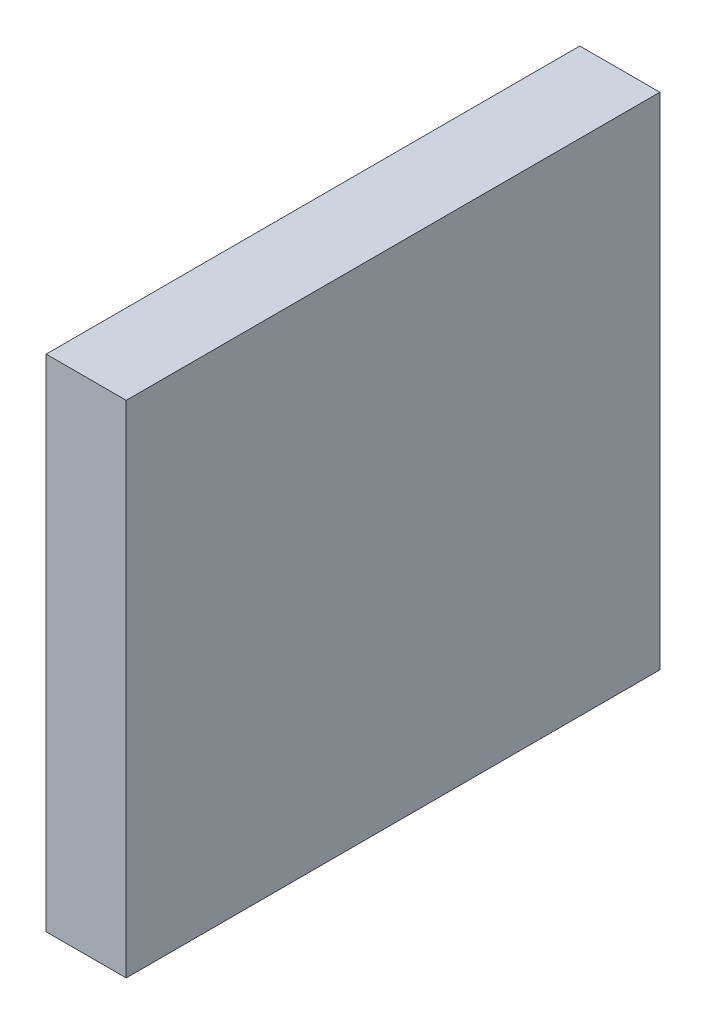
ISO-10303-21;
HEADER;
FILE_DESCRIPTION(('STEP AP214'),'2;1');
FILE_NAME('part.step','',(''),(''),'','','');
FILE_SCHEMA(('AUTOMOTIVE_DESIGN { 1 0 10303 214 1 1 1 1 }'));
ENDSEC;
DATA;
#1=APPLICATION_CONTEXT('core data for automotive mechanical design processes');
#2=APPLICATION_PROTOCOL_DEFINITION('international standard','automotive_design',2000,#1);
#3=PRODUCT_CONTEXT('',#1,'mechanical');
#4=PRODUCT('Part','Part','',(#3));
#5=PRODUCT_RELATED_PRODUCT_CATEGORY('part','',(#4));
#6=PRODUCT_DEFINITION_FORMATION('','',#4);
#7=PRODUCT_DEFINITION_CONTEXT('part definition',#1,'design');
#8=PRODUCT_DEFINITION('design','',#6,#7);
#9=PRODUCT_DEFINITION_SHAPE('','',#8);
#10=(LENGTH_UNIT() NAMED_UNIT(*) SI_UNIT(.MILLI.,.METRE.));
#11=(NAMED_UNIT(*) PLANE_ANGLE_UNIT() SI_UNIT($,.RADIAN.));
#12=(NAMED_UNIT(*) SI_UNIT($,.STERADIAN.) SOLID_ANGLE_UNIT());
#13=UNCERTAINTY_MEASURE_WITH_UNIT(LENGTH_MEASURE(1.E-05),#10,'distance_accuracy_value','');
#14=(GEOMETRIC_REPRESENTATION_CONTEXT(3) GLOBAL_UNCERTAINTY_ASSIGNED_CONTEXT((#13)) GLOBAL_UNIT_ASSIGNED_CONTEXT((#10,
#11,#12)) REPRESENTATION_CONTEXT('',''));
#15=CARTESIAN_POINT('',(0.,0.,0.));
#16=DIRECTION('',(0.,0.,1.));
#17=DIRECTION('',(1.,0.,0.));
#18=AXIS2_PLACEMENT_3D('',#15,#16,#17);
#19=CARTESIAN_POINT('',(0.,0.,96.));
#20=DIRECTION('',(1.,0.,0.));
#21=DIRECTION('',(0.,0.,-1.));
#22=AXIS2_PLACEMENT_3D('',#19,#20,#21);
#23=PLANE('',#22);
#24=DIRECTION('',(0.,-1.,0.));
#25=VECTOR('',#24,1.);
#26=CARTESIAN_POINT('',(0.,0.,0.));
#27=LINE('',#26,#25);
#28=CARTESIAN_POINT('',(0.,90.,0.));
#29=VERTEX_POINT('',#28);
#30=CARTESIAN_POINT('',(0.,0.,0.));
#31=VERTEX_POINT('',#30);
#32=EDGE_CURVE('E107',#29,#31,#27,.T.);
#33=ORIENTED_EDGE('',*,*,#32,.T.);
#34=DIRECTION('',(0.,0.,-1.));
#35=VECTOR('',#34,1.);
#36=CARTESIAN_POINT('',(0.,0.,96.));
#37=LINE('',#36,#35);
#38=CARTESIAN_POINT('',(0.,0.,96.));
#39=VERTEX_POINT('',#38);
#40=EDGE_CURVE('E11',#39,#31,#37,.T.);
#41=ORIENTED_EDGE('',*,*,#40,.F.);
#42=DIRECTION('',(0.,-1.,0.));
#43=VECTOR('',#42,1.);
#44=CARTESIAN_POINT('',(0.,0.,96.));
#45=LINE('',#44,#43);
#46=CARTESIAN_POINT('',(0.,90.,96.));
#47=VERTEX_POINT('',#46);
#48=EDGE_CURVE('E91',#47,#39,#45,.T.);
#49=ORIENTED_EDGE('',*,*,#48,.F.);
#50=DIRECTION('',(0.,0.,-1.));
#51=VECTOR('',#50,1.);
#52=CARTESIAN_POINT('',(0.,90.,96.));
#53=LINE('',#52,#51);
#54=EDGE_CURVE('E103',#47,#29,#53,.T.);
#55=ORIENTED_EDGE('',*,*,#54,.T.);
#56=EDGE_LOOP('',(#33,#41,#49,#55));
#57=FACE_BOUND('',#56,.T.);
#58=ADVANCED_FACE('F39',(#57),#23,.F.);
#59=CARTESIAN_POINT('',(0.,0.,96.));
#60=DIRECTION('',(0.,1.,0.));
#61=DIRECTION('',(0.,0.,1.));
#62=AXIS2_PLACEMENT_3D('',#59,#60,#61);
#63=PLANE('',#62);
#64=DIRECTION('',(1.,0.,0.));
#65=VECTOR('',#64,1.);
#66=CARTESIAN_POINT('',(0.,0.,0.));
#67=LINE('',#66,#65);
#68=CARTESIAN_POINT('',(14.4,0.,0.));
#69=VERTEX_POINT('',#68);
#70=EDGE_CURVE('E96',#31,#69,#67,.T.);
#71=ORIENTED_EDGE('',*,*,#70,.T.);
#72=DIRECTION('',(0.,0.,-1.));
#73=VECTOR('',#72,1.);
#74=CARTESIAN_POINT('',(14.4,0.,96.));
#75=LINE('',#74,#73);
#76=CARTESIAN_POINT('',(14.4,0.,96.));
#77=VERTEX_POINT('',#76);
#78=EDGE_CURVE('E48',#77,#69,#75,.T.);
#79=ORIENTED_EDGE('',*,*,#78,.F.);
#80=DIRECTION('',(1.,0.,0.));
#81=VECTOR('',#80,1.);
#82=CARTESIAN_POINT('',(0.,0.,96.));
#83=LINE('',#82,#81);
#84=EDGE_CURVE('E86',#39,#77,#83,.T.);
#85=ORIENTED_EDGE('',*,*,#84,.F.);
#86=ORIENTED_EDGE('',*,*,#40,.T.);
#87=EDGE_LOOP('',(#71,#79,#85,#86));
#88=FACE_BOUND('',#87,.T.);
#89=ADVANCED_FACE('F95',(#88),#63,.F.);
#90=CARTESIAN_POINT('',(14.4,0.,96.));
#91=DIRECTION('',(-1.,0.,0.));
#92=DIRECTION('',(0.,0.,1.));
#93=AXIS2_PLACEMENT_3D('',#90,#91,#92);
#94=PLANE('',#93);
#95=DIRECTION('',(0.,1.,0.));
#96=VECTOR('',#95,1.);
#97=CARTESIAN_POINT('',(14.4,0.,0.));
#98=LINE('',#97,#96);
#99=CARTESIAN_POINT('',(14.4,90.,0.));
#100=VERTEX_POINT('',#99);
#101=EDGE_CURVE('E73',#69,#100,#98,.T.);
#102=ORIENTED_EDGE('',*,*,#101,.T.);
#103=DIRECTION('',(0.,0.,-1.));
#104=VECTOR('',#103,1.);
#105=CARTESIAN_POINT('',(14.4,90.,96.));
#106=LINE('',#105,#104);
#107=CARTESIAN_POINT('',(14.4,90.,96.));
#108=VERTEX_POINT('',#107);
#109=EDGE_CURVE('E98',#108,#100,#106,.T.);
#110=ORIENTED_EDGE('',*,*,#109,.F.);
#111=DIRECTION('',(0.,1.,0.));
#112=VECTOR('',#111,1.);
#113=CARTESIAN_POINT('',(14.4,0.,96.));
#114=LINE('',#113,#112);
#115=EDGE_CURVE('E89',#77,#108,#114,.T.);
#116=ORIENTED_EDGE('',*,*,#115,.F.);
#117=ORIENTED_EDGE('',*,*,#78,.T.);
#118=EDGE_LOOP('',(#102,#110,#116,#117));
#119=FACE_BOUND('',#118,.T.);
#120=ADVANCED_FACE('F99',(#119),#94,.F.);
#121=CARTESIAN_POINT('',(0.,90.,96.));
#122=DIRECTION('',(0.,-1.,0.));
#123=DIRECTION('',(0.,0.,-1.));
#124=AXIS2_PLACEMENT_3D('',#121,#122,#123);
#125=PLANE('',#124);
#126=DIRECTION('',(-1.,0.,0.));
#127=VECTOR('',#126,1.);
#128=CARTESIAN_POINT('',(0.,90.,0.));
#129=LINE('',#128,#127);
#130=EDGE_CURVE('E79',#100,#29,#129,.T.);
#131=ORIENTED_EDGE('',*,*,#130,.T.);
#132=ORIENTED_EDGE('',*,*,#54,.F.);
#133=DIRECTION('',(-1.,0.,0.));
#134=VECTOR('',#133,1.);
#135=CARTESIAN_POINT('',(0.,90.,96.));
#136=LINE('',#135,#134);
#137=EDGE_CURVE('E56',#108,#47,#136,.T.);
#138=ORIENTED_EDGE('',*,*,#137,.F.);
#139=ORIENTED_EDGE('',*,*,#109,.T.);
#140=EDGE_LOOP('',(#131,#132,#138,#139));
#141=FACE_BOUND('',#140,.T.);
#142=ADVANCED_FACE('F120',(#141),#125,.F.);
#143=CARTESIAN_POINT('',(0.,0.,96.));
#144=DIRECTION('',(0.,0.,-1.));
#145=DIRECTION('',(-1.,0.,0.));
#146=AXIS2_PLACEMENT_3D('',#143,#144,#145);
#147=PLANE('',#146);
#148=ORIENTED_EDGE('',*,*,#48,.T.);
#149=ORIENTED_EDGE('',*,*,#84,.T.);
#150=ORIENTED_EDGE('',*,*,#115,.T.);
#151=ORIENTED_EDGE('',*,*,#137,.T.);
#152=EDGE_LOOP('',(#148,#149,#150,#151));
#153=FACE_BOUND('',#152,.T.);
#154=ADVANCED_FACE('F87',(#153),#147,.F.);
#155=CARTESIAN_POINT('',(0.,0.,0.));
#156=DIRECTION('',(0.,0.,-1.));
#157=DIRECTION('',(-1.,0.,0.));
#158=AXIS2_PLACEMENT_3D('',#155,#156,#157);
#159=PLANE('',#158);
#160=ORIENTED_EDGE('',*,*,#32,.F.);
#161=ORIENTED_EDGE('',*,*,#130,.F.);
#162=ORIENTED_EDGE('',*,*,#101,.F.);
#163=ORIENTED_EDGE('',*,*,#70,.F.);
#164=EDGE_LOOP('',(#160,#161,#162,#163));
#165=FACE_BOUND('',#164,.T.);
#166=ADVANCED_FACE('F123',(#165),#159,.T.);
#167=CLOSED_SHELL('',(#58,#89,#120,#142,#154,#166));
#168=MANIFOLD_SOLID_BREP('B2',#167);
#169=ADVANCED_BREP_SHAPE_REPRESENTATION('',(#18,#168),#14);
#170=SHAPE_DEFINITION_REPRESENTATION(#9,#169);
ENDSEC;
END-ISO-10303-21;
